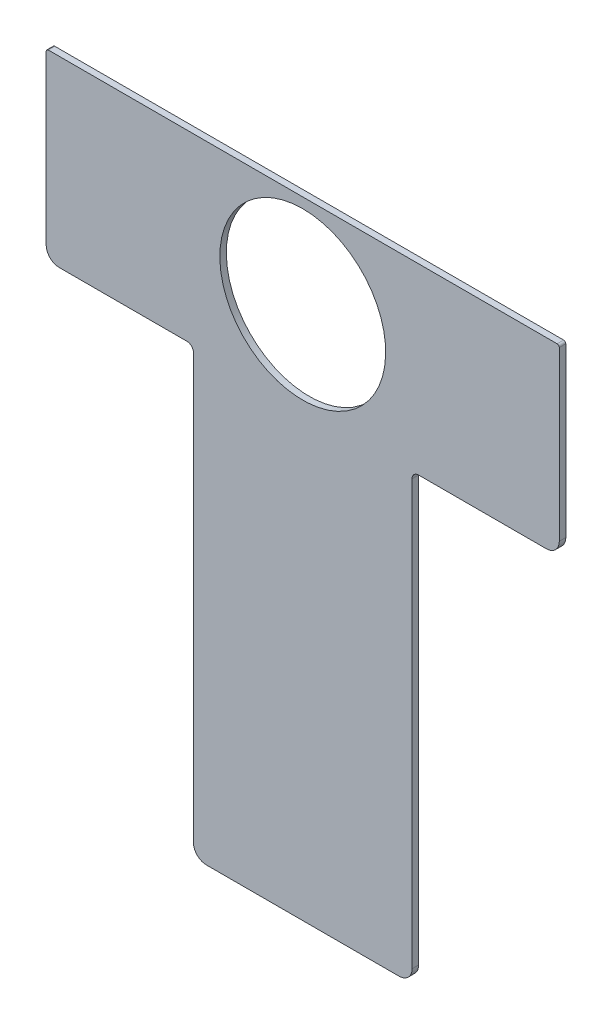
ISO-10303-21;
HEADER;
FILE_DESCRIPTION(('STEP AP214'),'2;1');
FILE_NAME('part.step','',(''),(''),'','','');
FILE_SCHEMA(('AUTOMOTIVE_DESIGN { 1 0 10303 214 1 1 1 1 }'));
ENDSEC;
DATA;
#1=APPLICATION_CONTEXT('core data for automotive mechanical design processes');
#2=APPLICATION_PROTOCOL_DEFINITION('international standard','automotive_design',2000,#1);
#3=PRODUCT_CONTEXT('',#1,'mechanical');
#4=PRODUCT('Part','Part','',(#3));
#5=PRODUCT_RELATED_PRODUCT_CATEGORY('part','',(#4));
#6=PRODUCT_DEFINITION_FORMATION('','',#4);
#7=PRODUCT_DEFINITION_CONTEXT('part definition',#1,'design');
#8=PRODUCT_DEFINITION('design','',#6,#7);
#9=PRODUCT_DEFINITION_SHAPE('','',#8);
#10=(LENGTH_UNIT() NAMED_UNIT(*) SI_UNIT(.MILLI.,.METRE.));
#11=(NAMED_UNIT(*) PLANE_ANGLE_UNIT() SI_UNIT($,.RADIAN.));
#12=(NAMED_UNIT(*) SI_UNIT($,.STERADIAN.) SOLID_ANGLE_UNIT());
#13=UNCERTAINTY_MEASURE_WITH_UNIT(LENGTH_MEASURE(1.E-05),#10,'distance_accuracy_value','');
#14=(GEOMETRIC_REPRESENTATION_CONTEXT(3) GLOBAL_UNCERTAINTY_ASSIGNED_CONTEXT((#13)) GLOBAL_UNIT_ASSIGNED_CONTEXT((#10,
#11,#12)) REPRESENTATION_CONTEXT('',''));
#15=CARTESIAN_POINT('',(0.,0.,0.));
#16=DIRECTION('',(0.,0.,1.));
#17=DIRECTION('',(1.,0.,0.));
#18=AXIS2_PLACEMENT_3D('',#15,#16,#17);
#19=CARTESIAN_POINT('',(-58.75,145.,-94.8499999999994));
#20=DIRECTION('',(0.,0.,1.));
#21=DIRECTION('',(1.,0.,0.));
#22=AXIS2_PLACEMENT_3D('',#19,#20,#21);
#23=CYLINDRICAL_SURFACE('',#22,0.500000000000004);
#24=DIRECTION('',(0.,0.,-1.));
#25=VECTOR('',#24,1.);
#26=CARTESIAN_POINT('',(-59.25,145.,-94.1));
#27=LINE('',#26,#25);
#28=CARTESIAN_POINT('',(-59.25,145.,-93.3500000000003));
#29=VERTEX_POINT('',#28);
#30=CARTESIAN_POINT('',(-59.25,145.,-94.8499999999993));
#31=VERTEX_POINT('',#30);
#32=EDGE_CURVE('E142',#29,#31,#27,.T.);
#33=ORIENTED_EDGE('',*,*,#32,.F.);
#34=CARTESIAN_POINT('',(-58.75,145.,-93.3500000000006));
#35=DIRECTION('',(0.,0.,1.));
#36=DIRECTION('',(1.,0.,0.));
#37=AXIS2_PLACEMENT_3D('',#34,#35,#36);
#38=CIRCLE('',#37,0.500000000000004);
#39=CARTESIAN_POINT('',(-58.75,145.5,-93.3500000000003));
#40=VERTEX_POINT('',#39);
#41=EDGE_CURVE('E20',#40,#29,#38,.T.);
#42=ORIENTED_EDGE('',*,*,#41,.F.);
#43=DIRECTION('',(0.,0.,1.));
#44=VECTOR('',#43,1.);
#45=CARTESIAN_POINT('',(-58.75,145.5,-94.1));
#46=LINE('',#45,#44);
#47=CARTESIAN_POINT('',(-58.75,145.5,-94.8499999999993));
#48=VERTEX_POINT('',#47);
#49=EDGE_CURVE('E196',#48,#40,#46,.T.);
#50=ORIENTED_EDGE('',*,*,#49,.F.);
#51=CARTESIAN_POINT('',(-58.75,145.,-94.8499999999994));
#52=DIRECTION('',(0.,0.,1.));
#53=DIRECTION('',(1.,0.,0.));
#54=AXIS2_PLACEMENT_3D('',#51,#52,#53);
#55=CIRCLE('',#54,0.500000000000004);
#56=EDGE_CURVE('E143',#31,#48,#55,.F.);
#57=ORIENTED_EDGE('',*,*,#56,.F.);
#58=EDGE_LOOP('',(#33,#42,#50,#57));
#59=FACE_BOUND('',#58,.T.);
#60=ADVANCED_FACE('F16',(#59),#23,.T.);
#61=CARTESIAN_POINT('',(58.75,145.,-94.8499999999994));
#62=DIRECTION('',(0.,0.,1.));
#63=DIRECTION('',(1.,0.,0.));
#64=AXIS2_PLACEMENT_3D('',#61,#62,#63);
#65=CYLINDRICAL_SURFACE('',#64,0.499999999999973);
#66=DIRECTION('',(0.,0.,-1.));
#67=VECTOR('',#66,1.);
#68=CARTESIAN_POINT('',(58.75,145.5,-94.1));
#69=LINE('',#68,#67);
#70=CARTESIAN_POINT('',(58.75,145.5,-93.3500000000003));
#71=VERTEX_POINT('',#70);
#72=CARTESIAN_POINT('',(58.75,145.5,-94.8499999999993));
#73=VERTEX_POINT('',#72);
#74=EDGE_CURVE('E199',#71,#73,#69,.T.);
#75=ORIENTED_EDGE('',*,*,#74,.F.);
#76=CARTESIAN_POINT('',(58.75,145.,-93.3500000000006));
#77=DIRECTION('',(0.,0.,1.));
#78=DIRECTION('',(1.,0.,0.));
#79=AXIS2_PLACEMENT_3D('',#76,#77,#78);
#80=CIRCLE('',#79,0.499999999999973);
#81=CARTESIAN_POINT('',(59.25,145.,-93.3500000000003));
#82=VERTEX_POINT('',#81);
#83=EDGE_CURVE('E140',#82,#71,#80,.T.);
#84=ORIENTED_EDGE('',*,*,#83,.F.);
#85=DIRECTION('',(0.,0.,1.));
#86=VECTOR('',#85,1.);
#87=CARTESIAN_POINT('',(59.25,145.,-94.1));
#88=LINE('',#87,#86);
#89=CARTESIAN_POINT('',(59.25,145.,-94.8499999999993));
#90=VERTEX_POINT('',#89);
#91=EDGE_CURVE('E192',#90,#82,#88,.T.);
#92=ORIENTED_EDGE('',*,*,#91,.F.);
#93=CARTESIAN_POINT('',(58.75,145.,-94.8499999999994));
#94=DIRECTION('',(0.,0.,1.));
#95=DIRECTION('',(1.,0.,0.));
#96=AXIS2_PLACEMENT_3D('',#93,#94,#95);
#97=CIRCLE('',#96,0.499999999999973);
#98=EDGE_CURVE('E216',#73,#90,#97,.F.);
#99=ORIENTED_EDGE('',*,*,#98,.F.);
#100=EDGE_LOOP('',(#75,#84,#92,#99));
#101=FACE_BOUND('',#100,.T.);
#102=ADVANCED_FACE('F260',(#101),#65,.T.);
#103=CARTESIAN_POINT('',(-61.62,148.395,-94.85));
#104=DIRECTION('',(0.,0.,-1.));
#105=DIRECTION('',(1.,0.,0.));
#106=AXIS2_PLACEMENT_3D('',#103,#104,#105);
#107=PLANE('',#106);
#108=CARTESIAN_POINT('',(0.,124.,-94.8499999999994));
#109=DIRECTION('',(0.,0.,-1.));
#110=DIRECTION('',(0.,1.,0.));
#111=AXIS2_PLACEMENT_3D('',#108,#109,#110);
#112=CIRCLE('',#111,19.15);
#113=CARTESIAN_POINT('',(0.,143.15,-94.8499999999994));
#114=VERTEX_POINT('',#113);
#115=EDGE_CURVE('E166',#114,#114,#112,.T.);
#116=ORIENTED_EDGE('',*,*,#115,.F.);
#117=EDGE_LOOP('',(#116));
#118=FACE_BOUND('',#117,.T.);
#119=DIRECTION('',(0.,-1.,0.));
#120=VECTOR('',#119,1.);
#121=CARTESIAN_POINT('',(-25.25,52.75,-94.8499999999992));
#122=LINE('',#121,#120);
#123=CARTESIAN_POINT('',(-25.25,101.75,-94.8499999999993));
#124=VERTEX_POINT('',#123);
#125=CARTESIAN_POINT('',(-25.25,3.75000000000016,-94.8499999999993));
#126=VERTEX_POINT('',#125);
#127=EDGE_CURVE('E214',#124,#126,#122,.T.);
#128=ORIENTED_EDGE('',*,*,#127,.F.);
#129=CARTESIAN_POINT('',(-26.75,101.75,-94.8499999999994));
#130=DIRECTION('',(0.,0.,-1.));
#131=DIRECTION('',(0.,1.,0.));
#132=AXIS2_PLACEMENT_3D('',#129,#130,#131);
#133=CIRCLE('',#132,1.5);
#134=CARTESIAN_POINT('',(-26.75,103.25,-94.8499999999993));
#135=VERTEX_POINT('',#134);
#136=EDGE_CURVE('E211',#135,#124,#133,.T.);
#137=ORIENTED_EDGE('',*,*,#136,.F.);
#138=DIRECTION('',(1.,0.,0.));
#139=VECTOR('',#138,1.);
#140=CARTESIAN_POINT('',(-41.5,103.25,-94.8499999999992));
#141=LINE('',#140,#139);
#142=CARTESIAN_POINT('',(-56.25,103.25,-94.8499999999993));
#143=VERTEX_POINT('',#142);
#144=EDGE_CURVE('E206',#143,#135,#141,.T.);
#145=ORIENTED_EDGE('',*,*,#144,.F.);
#146=CARTESIAN_POINT('',(-56.25,106.25,-94.8499999999994));
#147=DIRECTION('',(0.,0.,1.));
#148=DIRECTION('',(1.,0.,0.));
#149=AXIS2_PLACEMENT_3D('',#146,#147,#148);
#150=CIRCLE('',#149,2.99999999999999);
#151=CARTESIAN_POINT('',(-59.25,106.25,-94.8499999999993));
#152=VERTEX_POINT('',#151);
#153=EDGE_CURVE('E201',#143,#152,#150,.F.);
#154=ORIENTED_EDGE('',*,*,#153,.T.);
#155=DIRECTION('',(0.,-1.,0.));
#156=VECTOR('',#155,1.);
#157=CARTESIAN_POINT('',(-59.25,125.625,-94.8499999999992));
#158=LINE('',#157,#156);
#159=EDGE_CURVE('E147',#31,#152,#158,.T.);
#160=ORIENTED_EDGE('',*,*,#159,.F.);
#161=ORIENTED_EDGE('',*,*,#56,.T.);
#162=DIRECTION('',(-1.,0.,0.));
#163=VECTOR('',#162,1.);
#164=CARTESIAN_POINT('',(0.,145.5,-94.8499999999992));
#165=LINE('',#164,#163);
#166=EDGE_CURVE('E198',#73,#48,#165,.T.);
#167=ORIENTED_EDGE('',*,*,#166,.F.);
#168=ORIENTED_EDGE('',*,*,#98,.T.);
#169=DIRECTION('',(0.,1.,0.));
#170=VECTOR('',#169,1.);
#171=CARTESIAN_POINT('',(59.25,125.625,-94.8499999999992));
#172=LINE('',#171,#170);
#173=CARTESIAN_POINT('',(59.25,106.25,-94.8499999999993));
#174=VERTEX_POINT('',#173);
#175=EDGE_CURVE('E195',#174,#90,#172,.T.);
#176=ORIENTED_EDGE('',*,*,#175,.F.);
#177=CARTESIAN_POINT('',(56.25,106.25,-94.8499999999994));
#178=DIRECTION('',(0.,0.,1.));
#179=DIRECTION('',(1.,0.,0.));
#180=AXIS2_PLACEMENT_3D('',#177,#178,#179);
#181=CIRCLE('',#180,3.00000000000001);
#182=CARTESIAN_POINT('',(56.25,103.25,-94.8499999999993));
#183=VERTEX_POINT('',#182);
#184=EDGE_CURVE('E191',#174,#183,#181,.F.);
#185=ORIENTED_EDGE('',*,*,#184,.T.);
#186=DIRECTION('',(1.,0.,0.));
#187=VECTOR('',#186,1.);
#188=CARTESIAN_POINT('',(41.5,103.25,-94.8499999999992));
#189=LINE('',#188,#187);
#190=CARTESIAN_POINT('',(26.75,103.25,-94.8499999999993));
#191=VERTEX_POINT('',#190);
#192=EDGE_CURVE('E187',#191,#183,#189,.T.);
#193=ORIENTED_EDGE('',*,*,#192,.F.);
#194=CARTESIAN_POINT('',(26.75,101.75,-94.8499999999994));
#195=DIRECTION('',(0.,0.,-1.));
#196=DIRECTION('',(-1.,0.,0.));
#197=AXIS2_PLACEMENT_3D('',#194,#195,#196);
#198=CIRCLE('',#197,1.50000000000002);
#199=CARTESIAN_POINT('',(25.25,101.75,-94.8499999999993));
#200=VERTEX_POINT('',#199);
#201=EDGE_CURVE('E184',#200,#191,#198,.T.);
#202=ORIENTED_EDGE('',*,*,#201,.F.);
#203=DIRECTION('',(0.,1.,0.));
#204=VECTOR('',#203,1.);
#205=CARTESIAN_POINT('',(25.25,52.75,-94.8499999999992));
#206=LINE('',#205,#204);
#207=CARTESIAN_POINT('',(25.25,3.75,-94.8499999999993));
#208=VERTEX_POINT('',#207);
#209=EDGE_CURVE('E179',#208,#200,#206,.T.);
#210=ORIENTED_EDGE('',*,*,#209,.F.);
#211=CARTESIAN_POINT('',(22.25,3.75,-94.8499999999994));
#212=DIRECTION('',(0.,0.,1.));
#213=DIRECTION('',(1.,0.,0.));
#214=AXIS2_PLACEMENT_3D('',#211,#212,#213);
#215=CIRCLE('',#214,3.);
#216=CARTESIAN_POINT('',(22.25,0.75,-94.8499999999993));
#217=VERTEX_POINT('',#216);
#218=EDGE_CURVE('E175',#208,#217,#215,.F.);
#219=ORIENTED_EDGE('',*,*,#218,.T.);
#220=DIRECTION('',(1.,0.,0.));
#221=VECTOR('',#220,1.);
#222=CARTESIAN_POINT('',(0.,0.75,-94.8499999999992));
#223=LINE('',#222,#221);
#224=CARTESIAN_POINT('',(-22.25,0.75,-94.8499999999993));
#225=VERTEX_POINT('',#224);
#226=EDGE_CURVE('E170',#225,#217,#223,.T.);
#227=ORIENTED_EDGE('',*,*,#226,.F.);
#228=CARTESIAN_POINT('',(-22.25,3.75,-94.8499999999994));
#229=DIRECTION('',(0.,0.,1.));
#230=DIRECTION('',(1.,0.,0.));
#231=AXIS2_PLACEMENT_3D('',#228,#229,#230);
#232=CIRCLE('',#231,3.);
#233=EDGE_CURVE('E172',#225,#126,#232,.F.);
#234=ORIENTED_EDGE('',*,*,#233,.T.);
#235=EDGE_LOOP('',(#128,#137,#145,#154,#160,#161,#167,#168,#176,#185,#193,#202,#210,#219,#227,#234));
#236=FACE_BOUND('',#235,.T.);
#237=ADVANCED_FACE('F266',(#118,#236),#107,.T.);
#238=CARTESIAN_POINT('',(-25.25,1.79,-93.11182236692));
#239=DIRECTION('',(-1.,0.,0.));
#240=DIRECTION('',(0.,1.,0.));
#241=AXIS2_PLACEMENT_3D('',#238,#239,#240);
#242=PLANE('',#241);
#243=DIRECTION('',(0.,0.,1.));
#244=VECTOR('',#243,1.);
#245=CARTESIAN_POINT('',(-25.25,3.75000000000031,-94.1));
#246=LINE('',#245,#244);
#247=CARTESIAN_POINT('',(-25.25,3.75000000000015,-93.3500000000003));
#248=VERTEX_POINT('',#247);
#249=EDGE_CURVE('E167',#126,#248,#246,.T.);
#250=ORIENTED_EDGE('',*,*,#249,.T.);
#251=DIRECTION('',(0.,1.,0.));
#252=VECTOR('',#251,1.);
#253=CARTESIAN_POINT('',(-25.25,73.125,-93.35));
#254=LINE('',#253,#252);
#255=CARTESIAN_POINT('',(-25.25,101.75,-93.3500000000003));
#256=VERTEX_POINT('',#255);
#257=EDGE_CURVE('E163',#248,#256,#254,.T.);
#258=ORIENTED_EDGE('',*,*,#257,.T.);
#259=DIRECTION('',(0.,0.,1.));
#260=VECTOR('',#259,1.);
#261=CARTESIAN_POINT('',(-25.25,101.75,-94.1));
#262=LINE('',#261,#260);
#263=EDGE_CURVE('E209',#124,#256,#262,.T.);
#264=ORIENTED_EDGE('',*,*,#263,.F.);
#265=ORIENTED_EDGE('',*,*,#127,.T.);
#266=EDGE_LOOP('',(#250,#258,#264,#265));
#267=FACE_BOUND('',#266,.T.);
#268=ADVANCED_FACE('F279',(#267),#242,.T.);
#269=CARTESIAN_POINT('',(-26.75,101.75,-93.3500000000006));
#270=DIRECTION('',(0.,0.,-1.));
#271=DIRECTION('',(0.,1.,0.));
#272=AXIS2_PLACEMENT_3D('',#269,#270,#271);
#273=CYLINDRICAL_SURFACE('',#272,1.5);
#274=ORIENTED_EDGE('',*,*,#263,.T.);
#275=CARTESIAN_POINT('',(-26.75,101.75,-93.3500000000006));
#276=DIRECTION('',(0.,0.,-1.));
#277=DIRECTION('',(0.,1.,0.));
#278=AXIS2_PLACEMENT_3D('',#275,#276,#277);
#279=CIRCLE('',#278,1.5);
#280=CARTESIAN_POINT('',(-26.75,103.25,-93.3500000000003));
#281=VERTEX_POINT('',#280);
#282=EDGE_CURVE('E162',#256,#281,#279,.F.);
#283=ORIENTED_EDGE('',*,*,#282,.T.);
#284=DIRECTION('',(0.,0.,1.));
#285=VECTOR('',#284,1.);
#286=CARTESIAN_POINT('',(-26.75,103.25,-94.1));
#287=LINE('',#286,#285);
#288=EDGE_CURVE('E207',#135,#281,#287,.T.);
#289=ORIENTED_EDGE('',*,*,#288,.F.);
#290=ORIENTED_EDGE('',*,*,#136,.T.);
#291=EDGE_LOOP('',(#274,#283,#289,#290));
#292=FACE_BOUND('',#291,.T.);
#293=ADVANCED_FACE('F276',(#292),#273,.F.);
#294=CARTESIAN_POINT('',(-26.16,103.25,-93.11182236692));
#295=DIRECTION('',(0.,-1.,0.));
#296=DIRECTION('',(-1.,0.,0.));
#297=AXIS2_PLACEMENT_3D('',#294,#295,#296);
#298=PLANE('',#297);
#299=DIRECTION('',(0.,0.,-1.));
#300=VECTOR('',#299,1.);
#301=CARTESIAN_POINT('',(-56.25,103.25,-94.1));
#302=LINE('',#301,#300);
#303=CARTESIAN_POINT('',(-56.25,103.25,-93.3500000000003));
#304=VERTEX_POINT('',#303);
#305=EDGE_CURVE('E203',#304,#143,#302,.T.);
#306=ORIENTED_EDGE('',*,*,#305,.T.);
#307=ORIENTED_EDGE('',*,*,#144,.T.);
#308=ORIENTED_EDGE('',*,*,#288,.T.);
#309=DIRECTION('',(-1.,0.,0.));
#310=VECTOR('',#309,1.);
#311=CARTESIAN_POINT('',(0.,103.25,-93.35));
#312=LINE('',#311,#310);
#313=EDGE_CURVE('E156',#281,#304,#312,.T.);
#314=ORIENTED_EDGE('',*,*,#313,.T.);
#315=EDGE_LOOP('',(#306,#307,#308,#314));
#316=FACE_BOUND('',#315,.T.);
#317=ADVANCED_FACE('F273',(#316),#298,.T.);
#318=CARTESIAN_POINT('',(-56.25,106.25,-94.8499999999994));
#319=DIRECTION('',(0.,0.,1.));
#320=DIRECTION('',(1.,0.,0.));
#321=AXIS2_PLACEMENT_3D('',#318,#319,#320);
#322=CYLINDRICAL_SURFACE('',#321,2.99999999999999);
#323=ORIENTED_EDGE('',*,*,#305,.F.);
#324=CARTESIAN_POINT('',(-56.25,106.25,-93.3500000000006));
#325=DIRECTION('',(0.,0.,1.));
#326=DIRECTION('',(1.,0.,0.));
#327=AXIS2_PLACEMENT_3D('',#324,#325,#326);
#328=CIRCLE('',#327,2.99999999999999);
#329=CARTESIAN_POINT('',(-59.25,106.25,-93.3500000000003));
#330=VERTEX_POINT('',#329);
#331=EDGE_CURVE('E152',#304,#330,#328,.F.);
#332=ORIENTED_EDGE('',*,*,#331,.T.);
#333=DIRECTION('',(0.,0.,1.));
#334=VECTOR('',#333,1.);
#335=CARTESIAN_POINT('',(-59.25,106.25,-94.1));
#336=LINE('',#335,#334);
#337=EDGE_CURVE('E148',#152,#330,#336,.T.);
#338=ORIENTED_EDGE('',*,*,#337,.F.);
#339=ORIENTED_EDGE('',*,*,#153,.F.);
#340=EDGE_LOOP('',(#323,#332,#338,#339));
#341=FACE_BOUND('',#340,.T.);
#342=ADVANCED_FACE('F269',(#341),#322,.T.);
#343=CARTESIAN_POINT('',(-59.25,105.475,-93.11182236692));
#344=DIRECTION('',(-1.,0.,0.));
#345=DIRECTION('',(0.,1.,0.));
#346=AXIS2_PLACEMENT_3D('',#343,#344,#345);
#347=PLANE('',#346);
#348=ORIENTED_EDGE('',*,*,#32,.T.);
#349=ORIENTED_EDGE('',*,*,#159,.T.);
#350=ORIENTED_EDGE('',*,*,#337,.T.);
#351=DIRECTION('',(0.,1.,0.));
#352=VECTOR('',#351,1.);
#353=CARTESIAN_POINT('',(-59.25,73.125,-93.35));
#354=LINE('',#353,#352);
#355=EDGE_CURVE('E136',#330,#29,#354,.T.);
#356=ORIENTED_EDGE('',*,*,#355,.T.);
#357=EDGE_LOOP('',(#348,#349,#350,#356));
#358=FACE_BOUND('',#357,.T.);
#359=ADVANCED_FACE('F150',(#358),#347,.T.);
#360=CARTESIAN_POINT('',(-61.1,145.5,-93.11182236692));
#361=DIRECTION('',(0.,1.,0.));
#362=DIRECTION('',(1.,0.,0.));
#363=AXIS2_PLACEMENT_3D('',#360,#361,#362);
#364=PLANE('',#363);
#365=ORIENTED_EDGE('',*,*,#49,.T.);
#366=DIRECTION('',(1.,0.,0.));
#367=VECTOR('',#366,1.);
#368=CARTESIAN_POINT('',(0.,145.5,-93.35));
#369=LINE('',#368,#367);
#370=EDGE_CURVE('E139',#40,#71,#369,.T.);
#371=ORIENTED_EDGE('',*,*,#370,.T.);
#372=ORIENTED_EDGE('',*,*,#74,.T.);
#373=ORIENTED_EDGE('',*,*,#166,.T.);
#374=EDGE_LOOP('',(#365,#371,#372,#373));
#375=FACE_BOUND('',#374,.T.);
#376=ADVANCED_FACE('F263',(#375),#364,.T.);
#377=CARTESIAN_POINT('',(59.25,145.775,-93.11182236692));
#378=DIRECTION('',(1.,0.,0.));
#379=DIRECTION('',(0.,-1.,0.));
#380=AXIS2_PLACEMENT_3D('',#377,#378,#379);
#381=PLANE('',#380);
#382=ORIENTED_EDGE('',*,*,#91,.T.);
#383=DIRECTION('',(0.,-1.,0.));
#384=VECTOR('',#383,1.);
#385=CARTESIAN_POINT('',(59.25,73.125,-93.35));
#386=LINE('',#385,#384);
#387=CARTESIAN_POINT('',(59.25,106.25,-93.3500000000003));
#388=VERTEX_POINT('',#387);
#389=EDGE_CURVE('E154',#82,#388,#386,.T.);
#390=ORIENTED_EDGE('',*,*,#389,.T.);
#391=DIRECTION('',(0.,0.,-1.));
#392=VECTOR('',#391,1.);
#393=CARTESIAN_POINT('',(59.25,106.25,-94.1));
#394=LINE('',#393,#392);
#395=EDGE_CURVE('E188',#388,#174,#394,.T.);
#396=ORIENTED_EDGE('',*,*,#395,.T.);
#397=ORIENTED_EDGE('',*,*,#175,.T.);
#398=EDGE_LOOP('',(#382,#390,#396,#397));
#399=FACE_BOUND('',#398,.T.);
#400=ADVANCED_FACE('F293',(#399),#381,.T.);
#401=CARTESIAN_POINT('',(56.25,106.25,-94.8499999999994));
#402=DIRECTION('',(0.,0.,1.));
#403=DIRECTION('',(1.,0.,0.));
#404=AXIS2_PLACEMENT_3D('',#401,#402,#403);
#405=CYLINDRICAL_SURFACE('',#404,3.00000000000001);
#406=ORIENTED_EDGE('',*,*,#395,.F.);
#407=CARTESIAN_POINT('',(56.25,106.25,-93.3500000000006));
#408=DIRECTION('',(0.,0.,1.));
#409=DIRECTION('',(1.,0.,0.));
#410=AXIS2_PLACEMENT_3D('',#407,#408,#409);
#411=CIRCLE('',#410,3.00000000000001);
#412=CARTESIAN_POINT('',(56.25,103.25,-93.3500000000003));
#413=VERTEX_POINT('',#412);
#414=EDGE_CURVE('E237',#388,#413,#411,.F.);
#415=ORIENTED_EDGE('',*,*,#414,.T.);
#416=DIRECTION('',(0.,0.,1.));
#417=VECTOR('',#416,1.);
#418=CARTESIAN_POINT('',(56.25,103.25,-94.1));
#419=LINE('',#418,#417);
#420=EDGE_CURVE('E185',#183,#413,#419,.T.);
#421=ORIENTED_EDGE('',*,*,#420,.F.);
#422=ORIENTED_EDGE('',*,*,#184,.F.);
#423=EDGE_LOOP('',(#406,#415,#421,#422));
#424=FACE_BOUND('',#423,.T.);
#425=ADVANCED_FACE('F298',(#424),#405,.T.);
#426=CARTESIAN_POINT('',(56.84,103.25,-93.11182236692));
#427=DIRECTION('',(0.,-1.,0.));
#428=DIRECTION('',(-1.,0.,0.));
#429=AXIS2_PLACEMENT_3D('',#426,#427,#428);
#430=PLANE('',#429);
#431=ORIENTED_EDGE('',*,*,#420,.T.);
#432=DIRECTION('',(-1.,0.,0.));
#433=VECTOR('',#432,1.);
#434=CARTESIAN_POINT('',(0.,103.25,-93.35));
#435=LINE('',#434,#433);
#436=CARTESIAN_POINT('',(26.75,103.25,-93.3500000000003));
#437=VERTEX_POINT('',#436);
#438=EDGE_CURVE('E236',#413,#437,#435,.T.);
#439=ORIENTED_EDGE('',*,*,#438,.T.);
#440=DIRECTION('',(0.,0.,1.));
#441=VECTOR('',#440,1.);
#442=CARTESIAN_POINT('',(26.75,103.25,-94.1));
#443=LINE('',#442,#441);
#444=EDGE_CURVE('E182',#191,#437,#443,.T.);
#445=ORIENTED_EDGE('',*,*,#444,.F.);
#446=ORIENTED_EDGE('',*,*,#192,.T.);
#447=EDGE_LOOP('',(#431,#439,#445,#446));
#448=FACE_BOUND('',#447,.T.);
#449=ADVANCED_FACE('F301',(#448),#430,.T.);
#450=CARTESIAN_POINT('',(26.75,101.75,-93.3500000000006));
#451=DIRECTION('',(0.,0.,-1.));
#452=DIRECTION('',(-1.,0.,0.));
#453=AXIS2_PLACEMENT_3D('',#450,#451,#452);
#454=CYLINDRICAL_SURFACE('',#453,1.50000000000002);
#455=ORIENTED_EDGE('',*,*,#444,.T.);
#456=CARTESIAN_POINT('',(26.75,101.75,-93.3500000000006));
#457=DIRECTION('',(0.,0.,-1.));
#458=DIRECTION('',(-1.,0.,0.));
#459=AXIS2_PLACEMENT_3D('',#456,#457,#458);
#460=CIRCLE('',#459,1.50000000000002);
#461=CARTESIAN_POINT('',(25.25,101.75,-93.3500000000003));
#462=VERTEX_POINT('',#461);
#463=EDGE_CURVE('E233',#437,#462,#460,.F.);
#464=ORIENTED_EDGE('',*,*,#463,.T.);
#465=DIRECTION('',(0.,0.,1.));
#466=VECTOR('',#465,1.);
#467=CARTESIAN_POINT('',(25.25,101.75,-94.1));
#468=LINE('',#467,#466);
#469=EDGE_CURVE('E180',#200,#462,#468,.T.);
#470=ORIENTED_EDGE('',*,*,#469,.F.);
#471=ORIENTED_EDGE('',*,*,#201,.T.);
#472=EDGE_LOOP('',(#455,#464,#470,#471));
#473=FACE_BOUND('',#472,.T.);
#474=ADVANCED_FACE('F307',(#473),#454,.F.);
#475=CARTESIAN_POINT('',(25.25,103.71,-93.11182236692));
#476=DIRECTION('',(1.,0.,0.));
#477=DIRECTION('',(0.,-1.,0.));
#478=AXIS2_PLACEMENT_3D('',#475,#476,#477);
#479=PLANE('',#478);
#480=DIRECTION('',(0.,0.,-1.));
#481=VECTOR('',#480,1.);
#482=CARTESIAN_POINT('',(25.25,3.75,-94.1));
#483=LINE('',#482,#481);
#484=CARTESIAN_POINT('',(25.25,3.75,-93.3500000000003));
#485=VERTEX_POINT('',#484);
#486=EDGE_CURVE('E176',#485,#208,#483,.T.);
#487=ORIENTED_EDGE('',*,*,#486,.T.);
#488=ORIENTED_EDGE('',*,*,#209,.T.);
#489=ORIENTED_EDGE('',*,*,#469,.T.);
#490=DIRECTION('',(0.,-1.,0.));
#491=VECTOR('',#490,1.);
#492=CARTESIAN_POINT('',(25.25,73.125,-93.35));
#493=LINE('',#492,#491);
#494=EDGE_CURVE('E232',#462,#485,#493,.T.);
#495=ORIENTED_EDGE('',*,*,#494,.T.);
#496=EDGE_LOOP('',(#487,#488,#489,#495));
#497=FACE_BOUND('',#496,.T.);
#498=ADVANCED_FACE('F310',(#497),#479,.T.);
#499=CARTESIAN_POINT('',(22.25,3.75,-94.8499999999994));
#500=DIRECTION('',(0.,0.,1.));
#501=DIRECTION('',(1.,0.,0.));
#502=AXIS2_PLACEMENT_3D('',#499,#500,#501);
#503=CYLINDRICAL_SURFACE('',#502,3.);
#504=ORIENTED_EDGE('',*,*,#486,.F.);
#505=CARTESIAN_POINT('',(22.25,3.75,-93.3500000000006));
#506=DIRECTION('',(0.,0.,1.));
#507=DIRECTION('',(1.,0.,0.));
#508=AXIS2_PLACEMENT_3D('',#505,#506,#507);
#509=CIRCLE('',#508,3.);
#510=CARTESIAN_POINT('',(22.25,0.750000000000004,-93.3500000000003));
#511=VERTEX_POINT('',#510);
#512=EDGE_CURVE('E229',#485,#511,#509,.F.);
#513=ORIENTED_EDGE('',*,*,#512,.T.);
#514=DIRECTION('',(0.,0.,1.));
#515=VECTOR('',#514,1.);
#516=CARTESIAN_POINT('',(22.25,0.75,-94.1));
#517=LINE('',#516,#515);
#518=EDGE_CURVE('E173',#217,#511,#517,.T.);
#519=ORIENTED_EDGE('',*,*,#518,.F.);
#520=ORIENTED_EDGE('',*,*,#218,.F.);
#521=EDGE_LOOP('',(#504,#513,#519,#520));
#522=FACE_BOUND('',#521,.T.);
#523=ADVANCED_FACE('F312',(#522),#503,.T.);
#524=CARTESIAN_POINT('',(23.14,0.75,-93.11182236692));
#525=DIRECTION('',(0.,-1.,0.));
#526=DIRECTION('',(-1.,0.,0.));
#527=AXIS2_PLACEMENT_3D('',#524,#525,#526);
#528=PLANE('',#527);
#529=DIRECTION('',(0.,0.,-1.));
#530=VECTOR('',#529,1.);
#531=CARTESIAN_POINT('',(-22.25,0.75,-94.1));
#532=LINE('',#531,#530);
#533=CARTESIAN_POINT('',(-22.25,0.750000000000001,-93.3500000000003));
#534=VERTEX_POINT('',#533);
#535=EDGE_CURVE('E35',#534,#225,#532,.T.);
#536=ORIENTED_EDGE('',*,*,#535,.T.);
#537=ORIENTED_EDGE('',*,*,#226,.T.);
#538=ORIENTED_EDGE('',*,*,#518,.T.);
#539=DIRECTION('',(-1.,0.,0.));
#540=VECTOR('',#539,1.);
#541=CARTESIAN_POINT('',(0.,0.750000000000005,-93.35));
#542=LINE('',#541,#540);
#543=EDGE_CURVE('E228',#511,#534,#542,.T.);
#544=ORIENTED_EDGE('',*,*,#543,.T.);
#545=EDGE_LOOP('',(#536,#537,#538,#544));
#546=FACE_BOUND('',#545,.T.);
#547=ADVANCED_FACE('F285',(#546),#528,.T.);
#548=CARTESIAN_POINT('',(-22.25,3.75,-94.8499999999994));
#549=DIRECTION('',(0.,0.,1.));
#550=DIRECTION('',(1.,0.,0.));
#551=AXIS2_PLACEMENT_3D('',#548,#549,#550);
#552=CYLINDRICAL_SURFACE('',#551,3.);
#553=ORIENTED_EDGE('',*,*,#535,.F.);
#554=CARTESIAN_POINT('',(-22.25,3.75,-93.3500000000006));
#555=DIRECTION('',(0.,0.,1.));
#556=DIRECTION('',(1.,0.,0.));
#557=AXIS2_PLACEMENT_3D('',#554,#555,#556);
#558=CIRCLE('',#557,3.);
#559=EDGE_CURVE('E26',#534,#248,#558,.F.);
#560=ORIENTED_EDGE('',*,*,#559,.T.);
#561=ORIENTED_EDGE('',*,*,#249,.F.);
#562=ORIENTED_EDGE('',*,*,#233,.F.);
#563=EDGE_LOOP('',(#553,#560,#561,#562));
#564=FACE_BOUND('',#563,.T.);
#565=ADVANCED_FACE('F281',(#564),#552,.T.);
#566=CARTESIAN_POINT('',(0.,124.,-93.3500000000006));
#567=DIRECTION('',(0.,0.,-1.));
#568=DIRECTION('',(0.,1.,0.));
#569=AXIS2_PLACEMENT_3D('',#566,#567,#568);
#570=CYLINDRICAL_SURFACE('',#569,19.15);
#571=ORIENTED_EDGE('',*,*,#115,.T.);
#572=EDGE_LOOP('',(#571));
#573=FACE_BOUND('',#572,.T.);
#574=CARTESIAN_POINT('',(0.,124.,-93.3500000000006));
#575=DIRECTION('',(0.,0.,-1.));
#576=DIRECTION('',(0.,1.,0.));
#577=AXIS2_PLACEMENT_3D('',#574,#575,#576);
#578=CIRCLE('',#577,19.15);
#579=CARTESIAN_POINT('',(0.,143.15,-93.3500000000006));
#580=VERTEX_POINT('',#579);
#581=EDGE_CURVE('E11',#580,#580,#578,.F.);
#582=ORIENTED_EDGE('',*,*,#581,.T.);
#583=EDGE_LOOP('',(#582));
#584=FACE_BOUND('',#583,.T.);
#585=ADVANCED_FACE('F324',(#573,#584),#570,.F.);
#586=CARTESIAN_POINT('',(-61.62,148.395,-93.35));
#587=DIRECTION('',(0.,0.,-1.));
#588=DIRECTION('',(1.,0.,0.));
#589=AXIS2_PLACEMENT_3D('',#586,#587,#588);
#590=PLANE('',#589);
#591=ORIENTED_EDGE('',*,*,#581,.F.);
#592=EDGE_LOOP('',(#591));
#593=FACE_BOUND('',#592,.T.);
#594=ORIENTED_EDGE('',*,*,#543,.F.);
#595=ORIENTED_EDGE('',*,*,#512,.F.);
#596=ORIENTED_EDGE('',*,*,#494,.F.);
#597=ORIENTED_EDGE('',*,*,#463,.F.);
#598=ORIENTED_EDGE('',*,*,#438,.F.);
#599=ORIENTED_EDGE('',*,*,#414,.F.);
#600=ORIENTED_EDGE('',*,*,#389,.F.);
#601=ORIENTED_EDGE('',*,*,#83,.T.);
#602=ORIENTED_EDGE('',*,*,#370,.F.);
#603=ORIENTED_EDGE('',*,*,#41,.T.);
#604=ORIENTED_EDGE('',*,*,#355,.F.);
#605=ORIENTED_EDGE('',*,*,#331,.F.);
#606=ORIENTED_EDGE('',*,*,#313,.F.);
#607=ORIENTED_EDGE('',*,*,#282,.F.);
#608=ORIENTED_EDGE('',*,*,#257,.F.);
#609=ORIENTED_EDGE('',*,*,#559,.F.);
#610=EDGE_LOOP('',(#594,#595,#596,#597,#598,#599,#600,#601,#602,#603,#604,#605,#606,#607,#608,#609));
#611=FACE_BOUND('',#610,.T.);
#612=ADVANCED_FACE('F18',(#593,#611),#590,.F.);
#613=CLOSED_SHELL('',(#60,#102,#237,#268,#293,#317,#342,#359,#376,#400,#425,#449,#474,#498,#523,
#547,#565,#585,#612));
#614=MANIFOLD_SOLID_BREP('B1',#613);
#615=ADVANCED_BREP_SHAPE_REPRESENTATION('',(#18,#614),#14);
#616=SHAPE_DEFINITION_REPRESENTATION(#9,#615);
ENDSEC;
END-ISO-10303-21;
